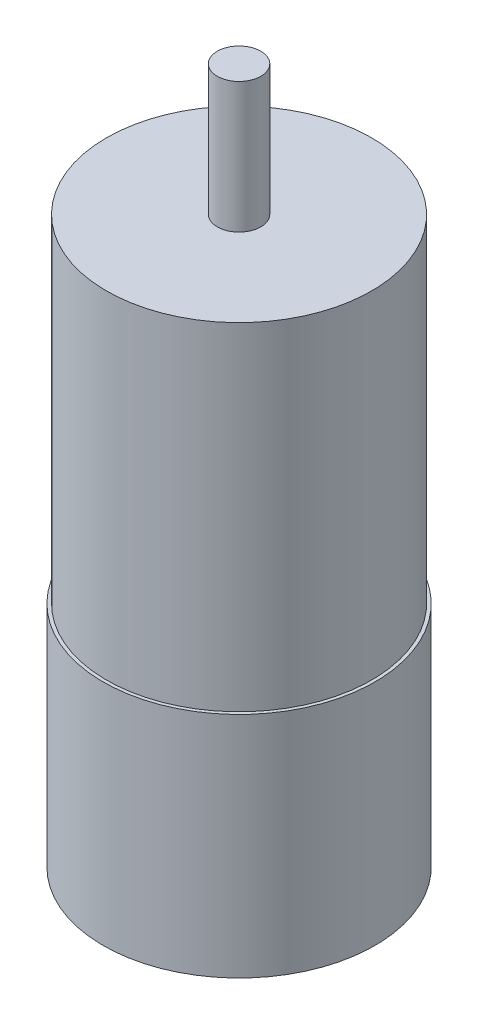
ISO-10303-21;
HEADER;
FILE_DESCRIPTION(('STEP AP214'),'2;1');
FILE_NAME('part.step','',(''),(''),'','','');
FILE_SCHEMA(('AUTOMOTIVE_DESIGN { 1 0 10303 214 1 1 1 1 }'));
ENDSEC;
DATA;
#1=APPLICATION_CONTEXT('core data for automotive mechanical design processes');
#2=APPLICATION_PROTOCOL_DEFINITION('international standard','automotive_design',2000,#1);
#3=PRODUCT_CONTEXT('',#1,'mechanical');
#4=PRODUCT('Part','Part','',(#3));
#5=PRODUCT_RELATED_PRODUCT_CATEGORY('part','',(#4));
#6=PRODUCT_DEFINITION_FORMATION('','',#4);
#7=PRODUCT_DEFINITION_CONTEXT('part definition',#1,'design');
#8=PRODUCT_DEFINITION('design','',#6,#7);
#9=PRODUCT_DEFINITION_SHAPE('','',#8);
#10=(LENGTH_UNIT() NAMED_UNIT(*) SI_UNIT(.MILLI.,.METRE.));
#11=(NAMED_UNIT(*) PLANE_ANGLE_UNIT() SI_UNIT($,.RADIAN.));
#12=(NAMED_UNIT(*) SI_UNIT($,.STERADIAN.) SOLID_ANGLE_UNIT());
#13=UNCERTAINTY_MEASURE_WITH_UNIT(LENGTH_MEASURE(1.E-05),#10,'distance_accuracy_value','');
#14=(GEOMETRIC_REPRESENTATION_CONTEXT(3) GLOBAL_UNCERTAINTY_ASSIGNED_CONTEXT((#13)) GLOBAL_UNIT_ASSIGNED_CONTEXT((#10,
#11,#12)) REPRESENTATION_CONTEXT('',''));
#15=CARTESIAN_POINT('',(0.,0.,0.));
#16=DIRECTION('',(0.,0.,1.));
#17=DIRECTION('',(1.,0.,0.));
#18=AXIS2_PLACEMENT_3D('',#15,#16,#17);
#19=CARTESIAN_POINT('',(0.,32.5333333333333,0.));
#20=DIRECTION('',(0.,1.,0.));
#21=DIRECTION('',(-1.,0.,0.));
#22=AXIS2_PLACEMENT_3D('',#19,#20,#21);
#23=PLANE('',#22);
#24=CARTESIAN_POINT('',(0.,32.5333333333333,0.));
#25=DIRECTION('',(0.,1.,0.));
#26=DIRECTION('',(-1.,0.,0.));
#27=AXIS2_PLACEMENT_3D('',#24,#25,#26);
#28=CIRCLE('',#27,12.2);
#29=CARTESIAN_POINT('',(-12.2,32.5333333333333,0.));
#30=VERTEX_POINT('',#29);
#31=EDGE_CURVE('E59',#30,#30,#28,.T.);
#32=ORIENTED_EDGE('',*,*,#31,.T.);
#33=EDGE_LOOP('',(#32));
#34=FACE_BOUND('',#33,.T.);
#35=CARTESIAN_POINT('',(0.,32.5333333333333,0.));
#36=DIRECTION('',(0.,1.,0.));
#37=DIRECTION('',(-1.,0.,0.));
#38=AXIS2_PLACEMENT_3D('',#35,#36,#37);
#39=CIRCLE('',#38,2.);
#40=CARTESIAN_POINT('',(-2.,32.5333333333333,0.));
#41=VERTEX_POINT('',#40);
#42=EDGE_CURVE('E10',#41,#41,#39,.T.);
#43=ORIENTED_EDGE('',*,*,#42,.F.);
#44=EDGE_LOOP('',(#43));
#45=FACE_BOUND('',#44,.T.);
#46=ADVANCED_FACE('F37',(#34,#45),#23,.T.);
#47=CARTESIAN_POINT('',(0.,32.5333333333333,0.));
#48=DIRECTION('',(0.,1.,0.));
#49=DIRECTION('',(-1.,0.,0.));
#50=AXIS2_PLACEMENT_3D('',#47,#48,#49);
#51=CYLINDRICAL_SURFACE('',#50,2.);
#52=ORIENTED_EDGE('',*,*,#42,.T.);
#53=EDGE_LOOP('',(#52));
#54=FACE_BOUND('',#53,.T.);
#55=CARTESIAN_POINT('',(0.,44.5333333333333,0.));
#56=DIRECTION('',(0.,1.,0.));
#57=DIRECTION('',(-1.,0.,0.));
#58=AXIS2_PLACEMENT_3D('',#55,#56,#57);
#59=CIRCLE('',#58,2.);
#60=CARTESIAN_POINT('',(-2.,44.5333333333333,0.));
#61=VERTEX_POINT('',#60);
#62=EDGE_CURVE('E43',#61,#61,#59,.T.);
#63=ORIENTED_EDGE('',*,*,#62,.F.);
#64=EDGE_LOOP('',(#63));
#65=FACE_BOUND('',#64,.T.);
#66=ADVANCED_FACE('F83',(#54,#65),#51,.T.);
#67=CARTESIAN_POINT('',(0.,44.5333333333333,0.));
#68=DIRECTION('',(0.,1.,0.));
#69=DIRECTION('',(-1.,0.,0.));
#70=AXIS2_PLACEMENT_3D('',#67,#68,#69);
#71=PLANE('',#70);
#72=ORIENTED_EDGE('',*,*,#62,.T.);
#73=EDGE_LOOP('',(#72));
#74=FACE_BOUND('',#73,.T.);
#75=ADVANCED_FACE('F87',(#74),#71,.T.);
#76=CARTESIAN_POINT('',(0.,-19.4666666666667,0.));
#77=DIRECTION('',(0.,1.,0.));
#78=DIRECTION('',(-1.,0.,0.));
#79=AXIS2_PLACEMENT_3D('',#76,#77,#78);
#80=PLANE('',#79);
#81=CARTESIAN_POINT('',(0.,-19.4666666666667,0.));
#82=DIRECTION('',(0.,1.,0.));
#83=DIRECTION('',(-1.,0.,0.));
#84=AXIS2_PLACEMENT_3D('',#81,#82,#83);
#85=CIRCLE('',#84,12.5);
#86=CARTESIAN_POINT('',(-12.5,-19.4666666666667,0.));
#87=VERTEX_POINT('',#86);
#88=EDGE_CURVE('E47',#87,#87,#85,.T.);
#89=ORIENTED_EDGE('',*,*,#88,.F.);
#90=EDGE_LOOP('',(#89));
#91=FACE_BOUND('',#90,.T.);
#92=ADVANCED_FACE('F79',(#91),#80,.F.);
#93=CARTESIAN_POINT('',(0.,32.5333333333333,0.));
#94=DIRECTION('',(0.,1.,0.));
#95=DIRECTION('',(-1.,0.,0.));
#96=AXIS2_PLACEMENT_3D('',#93,#94,#95);
#97=CYLINDRICAL_SURFACE('',#96,12.5);
#98=CARTESIAN_POINT('',(0.,1.53333333333333,0.));
#99=DIRECTION('',(0.,1.,0.));
#100=DIRECTION('',(-1.,0.,0.));
#101=AXIS2_PLACEMENT_3D('',#98,#99,#100);
#102=CIRCLE('',#101,12.5);
#103=CARTESIAN_POINT('',(-12.5,1.53333333333333,0.));
#104=VERTEX_POINT('',#103);
#105=EDGE_CURVE('E51',#104,#104,#102,.T.);
#106=ORIENTED_EDGE('',*,*,#105,.F.);
#107=EDGE_LOOP('',(#106));
#108=FACE_BOUND('',#107,.T.);
#109=ORIENTED_EDGE('',*,*,#88,.T.);
#110=EDGE_LOOP('',(#109));
#111=FACE_BOUND('',#110,.T.);
#112=ADVANCED_FACE('F73',(#108,#111),#97,.T.);
#113=CARTESIAN_POINT('',(0.,1.53333333333333,0.));
#114=DIRECTION('',(0.,1.,0.));
#115=DIRECTION('',(-1.,0.,0.));
#116=AXIS2_PLACEMENT_3D('',#113,#114,#115);
#117=PLANE('',#116);
#118=ORIENTED_EDGE('',*,*,#105,.T.);
#119=EDGE_LOOP('',(#118));
#120=FACE_BOUND('',#119,.T.);
#121=CARTESIAN_POINT('',(0.,1.53333333333333,0.));
#122=DIRECTION('',(0.,1.,0.));
#123=DIRECTION('',(-1.,0.,0.));
#124=AXIS2_PLACEMENT_3D('',#121,#122,#123);
#125=CIRCLE('',#124,12.2);
#126=CARTESIAN_POINT('',(-12.2,1.53333333333333,0.));
#127=VERTEX_POINT('',#126);
#128=EDGE_CURVE('E56',#127,#127,#125,.T.);
#129=ORIENTED_EDGE('',*,*,#128,.F.);
#130=EDGE_LOOP('',(#129));
#131=FACE_BOUND('',#130,.T.);
#132=ADVANCED_FACE('F68',(#120,#131),#117,.T.);
#133=CARTESIAN_POINT('',(0.,32.5333333333333,0.));
#134=DIRECTION('',(0.,1.,0.));
#135=DIRECTION('',(-1.,0.,0.));
#136=AXIS2_PLACEMENT_3D('',#133,#134,#135);
#137=CYLINDRICAL_SURFACE('',#136,12.2);
#138=ORIENTED_EDGE('',*,*,#31,.F.);
#139=EDGE_LOOP('',(#138));
#140=FACE_BOUND('',#139,.T.);
#141=ORIENTED_EDGE('',*,*,#128,.T.);
#142=EDGE_LOOP('',(#141));
#143=FACE_BOUND('',#142,.T.);
#144=ADVANCED_FACE('F65',(#140,#143),#137,.T.);
#145=CLOSED_SHELL('',(#46,#66,#75,#92,#112,#132,#144));
#146=MANIFOLD_SOLID_BREP('B2',#145);
#147=ADVANCED_BREP_SHAPE_REPRESENTATION('',(#18,#146),#14);
#148=SHAPE_DEFINITION_REPRESENTATION(#9,#147);
ENDSEC;
END-ISO-10303-21;
